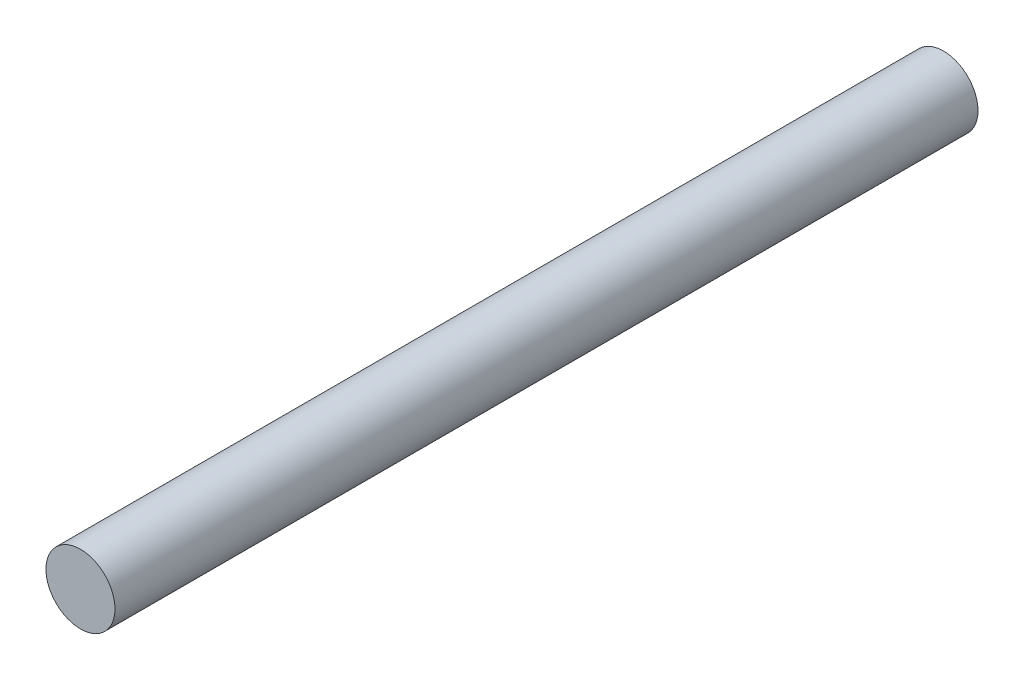
ISO-10303-21;
HEADER;
FILE_DESCRIPTION(('STEP AP214'),'2;1');
FILE_NAME('part.step','',(''),(''),'','','');
FILE_SCHEMA(('AUTOMOTIVE_DESIGN { 1 0 10303 214 1 1 1 1 }'));
ENDSEC;
DATA;
#1=APPLICATION_CONTEXT('core data for automotive mechanical design processes');
#2=APPLICATION_PROTOCOL_DEFINITION('international standard','automotive_design',2000,#1);
#3=PRODUCT_CONTEXT('',#1,'mechanical');
#4=PRODUCT('Part','Part','',(#3));
#5=PRODUCT_RELATED_PRODUCT_CATEGORY('part','',(#4));
#6=PRODUCT_DEFINITION_FORMATION('','',#4);
#7=PRODUCT_DEFINITION_CONTEXT('part definition',#1,'design');
#8=PRODUCT_DEFINITION('design','',#6,#7);
#9=PRODUCT_DEFINITION_SHAPE('','',#8);
#10=(LENGTH_UNIT() NAMED_UNIT(*) SI_UNIT(.MILLI.,.METRE.));
#11=(NAMED_UNIT(*) PLANE_ANGLE_UNIT() SI_UNIT($,.RADIAN.));
#12=(NAMED_UNIT(*) SI_UNIT($,.STERADIAN.) SOLID_ANGLE_UNIT());
#13=UNCERTAINTY_MEASURE_WITH_UNIT(LENGTH_MEASURE(1.E-05),#10,'distance_accuracy_value','');
#14=(GEOMETRIC_REPRESENTATION_CONTEXT(3) GLOBAL_UNCERTAINTY_ASSIGNED_CONTEXT((#13)) GLOBAL_UNIT_ASSIGNED_CONTEXT((#10,
#11,#12)) REPRESENTATION_CONTEXT('',''));
#15=CARTESIAN_POINT('',(0.,0.,0.));
#16=DIRECTION('',(0.,0.,1.));
#17=DIRECTION('',(1.,0.,0.));
#18=AXIS2_PLACEMENT_3D('',#15,#16,#17);
#19=CARTESIAN_POINT('',(0.,0.,50.));
#20=DIRECTION('',(0.,0.,-1.));
#21=DIRECTION('',(-1.,0.,0.));
#22=AXIS2_PLACEMENT_3D('',#19,#20,#21);
#23=CYLINDRICAL_SURFACE('',#22,4.);
#24=CARTESIAN_POINT('',(0.,0.,50.));
#25=DIRECTION('',(0.,0.,1.));
#26=DIRECTION('',(1.,0.,0.));
#27=AXIS2_PLACEMENT_3D('',#24,#25,#26);
#28=CIRCLE('',#27,4.);
#29=CARTESIAN_POINT('',(4.,0.,50.));
#30=VERTEX_POINT('',#29);
#31=EDGE_CURVE('E10',#30,#30,#28,.T.);
#32=ORIENTED_EDGE('',*,*,#31,.F.);
#33=EDGE_LOOP('',(#32));
#34=FACE_BOUND('',#33,.T.);
#35=CARTESIAN_POINT('',(0.,0.,-50.));
#36=DIRECTION('',(0.,0.,1.));
#37=DIRECTION('',(1.,0.,0.));
#38=AXIS2_PLACEMENT_3D('',#35,#36,#37);
#39=CIRCLE('',#38,4.);
#40=CARTESIAN_POINT('',(4.,0.,-50.));
#41=VERTEX_POINT('',#40);
#42=EDGE_CURVE('E32',#41,#41,#39,.T.);
#43=ORIENTED_EDGE('',*,*,#42,.T.);
#44=EDGE_LOOP('',(#43));
#45=FACE_BOUND('',#44,.T.);
#46=ADVANCED_FACE('F29',(#34,#45),#23,.T.);
#47=CARTESIAN_POINT('',(0.,0.,50.));
#48=DIRECTION('',(0.,0.,1.));
#49=DIRECTION('',(1.,0.,0.));
#50=AXIS2_PLACEMENT_3D('',#47,#48,#49);
#51=PLANE('',#50);
#52=ORIENTED_EDGE('',*,*,#31,.T.);
#53=EDGE_LOOP('',(#52));
#54=FACE_BOUND('',#53,.T.);
#55=ADVANCED_FACE('F44',(#54),#51,.T.);
#56=CARTESIAN_POINT('',(0.,0.,-50.));
#57=DIRECTION('',(0.,0.,1.));
#58=DIRECTION('',(1.,0.,0.));
#59=AXIS2_PLACEMENT_3D('',#56,#57,#58);
#60=PLANE('',#59);
#61=ORIENTED_EDGE('',*,*,#42,.F.);
#62=EDGE_LOOP('',(#61));
#63=FACE_BOUND('',#62,.T.);
#64=ADVANCED_FACE('F42',(#63),#60,.F.);
#65=CLOSED_SHELL('',(#46,#55,#64));
#66=MANIFOLD_SOLID_BREP('B2',#65);
#67=ADVANCED_BREP_SHAPE_REPRESENTATION('',(#18,#66),#14);
#68=SHAPE_DEFINITION_REPRESENTATION(#9,#67);
ENDSEC;
END-ISO-10303-21;
